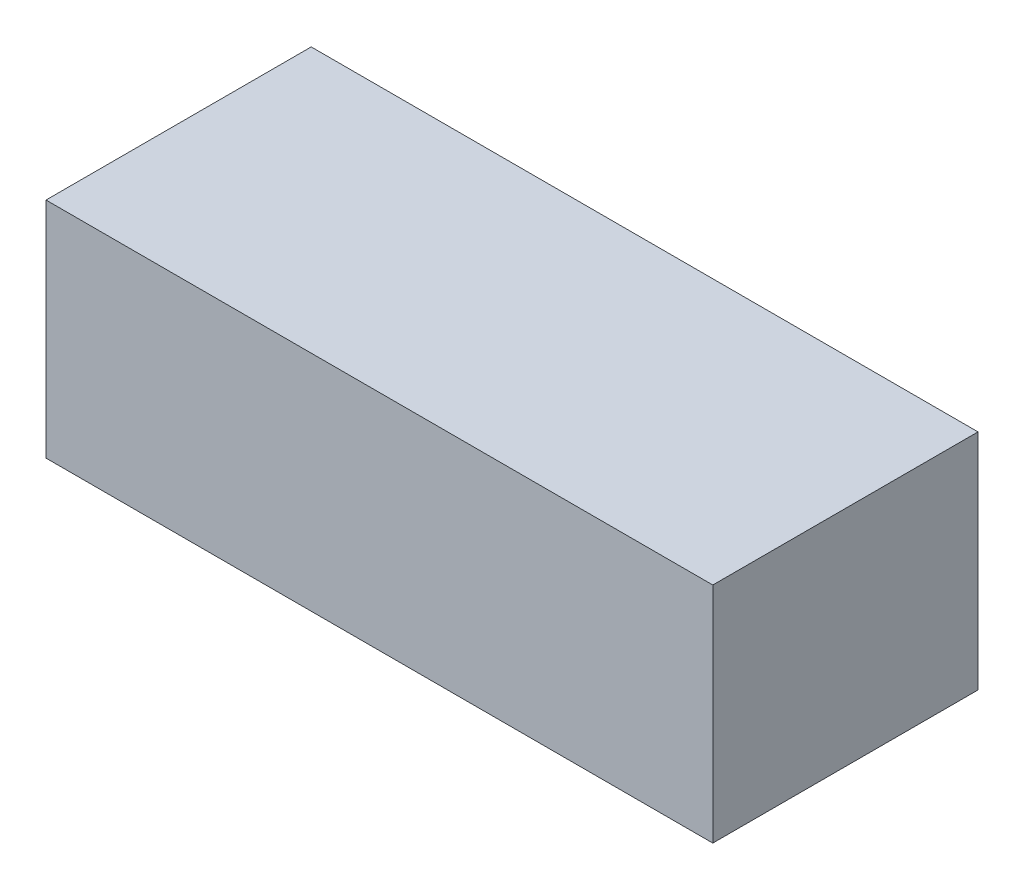
ISO-10303-21;
HEADER;
FILE_DESCRIPTION(('STEP AP214'),'2;1');
FILE_NAME('part.step','',(''),(''),'','','');
FILE_SCHEMA(('AUTOMOTIVE_DESIGN { 1 0 10303 214 1 1 1 1 }'));
ENDSEC;
DATA;
#1=APPLICATION_CONTEXT('core data for automotive mechanical design processes');
#2=APPLICATION_PROTOCOL_DEFINITION('international standard','automotive_design',2000,#1);
#3=PRODUCT_CONTEXT('',#1,'mechanical');
#4=PRODUCT('Part','Part','',(#3));
#5=PRODUCT_RELATED_PRODUCT_CATEGORY('part','',(#4));
#6=PRODUCT_DEFINITION_FORMATION('','',#4);
#7=PRODUCT_DEFINITION_CONTEXT('part definition',#1,'design');
#8=PRODUCT_DEFINITION('design','',#6,#7);
#9=PRODUCT_DEFINITION_SHAPE('','',#8);
#10=(LENGTH_UNIT() NAMED_UNIT(*) SI_UNIT(.MILLI.,.METRE.));
#11=(NAMED_UNIT(*) PLANE_ANGLE_UNIT() SI_UNIT($,.RADIAN.));
#12=(NAMED_UNIT(*) SI_UNIT($,.STERADIAN.) SOLID_ANGLE_UNIT());
#13=UNCERTAINTY_MEASURE_WITH_UNIT(LENGTH_MEASURE(1.E-05),#10,'distance_accuracy_value','');
#14=(GEOMETRIC_REPRESENTATION_CONTEXT(3) GLOBAL_UNCERTAINTY_ASSIGNED_CONTEXT((#13)) GLOBAL_UNIT_ASSIGNED_CONTEXT((#10,
#11,#12)) REPRESENTATION_CONTEXT('',''));
#15=CARTESIAN_POINT('',(0.,0.,0.));
#16=DIRECTION('',(0.,0.,1.));
#17=DIRECTION('',(1.,0.,0.));
#18=AXIS2_PLACEMENT_3D('',#15,#16,#17);
#19=CARTESIAN_POINT('',(-88.,59.,35.));
#20=DIRECTION('',(1.,0.,0.));
#21=DIRECTION('',(0.,0.,-1.));
#22=AXIS2_PLACEMENT_3D('',#19,#20,#21);
#23=PLANE('',#22);
#24=DIRECTION('',(0.,0.,1.));
#25=VECTOR('',#24,1.);
#26=CARTESIAN_POINT('',(-88.,0.,35.));
#27=LINE('',#26,#25);
#28=CARTESIAN_POINT('',(-88.,0.,-35.));
#29=VERTEX_POINT('',#28);
#30=CARTESIAN_POINT('',(-88.,0.,35.));
#31=VERTEX_POINT('',#30);
#32=EDGE_CURVE('E105',#29,#31,#27,.T.);
#33=ORIENTED_EDGE('',*,*,#32,.T.);
#34=DIRECTION('',(0.,-1.,0.));
#35=VECTOR('',#34,1.);
#36=CARTESIAN_POINT('',(-88.,59.,35.));
#37=LINE('',#36,#35);
#38=CARTESIAN_POINT('',(-88.,59.,35.));
#39=VERTEX_POINT('',#38);
#40=EDGE_CURVE('E11',#39,#31,#37,.T.);
#41=ORIENTED_EDGE('',*,*,#40,.F.);
#42=DIRECTION('',(0.,0.,1.));
#43=VECTOR('',#42,1.);
#44=CARTESIAN_POINT('',(-88.,59.,35.));
#45=LINE('',#44,#43);
#46=CARTESIAN_POINT('',(-88.,59.,-35.));
#47=VERTEX_POINT('',#46);
#48=EDGE_CURVE('E93',#47,#39,#45,.T.);
#49=ORIENTED_EDGE('',*,*,#48,.F.);
#50=DIRECTION('',(0.,-1.,0.));
#51=VECTOR('',#50,1.);
#52=CARTESIAN_POINT('',(-88.,59.,-35.));
#53=LINE('',#52,#51);
#54=EDGE_CURVE('E101',#47,#29,#53,.T.);
#55=ORIENTED_EDGE('',*,*,#54,.T.);
#56=EDGE_LOOP('',(#33,#41,#49,#55));
#57=FACE_BOUND('',#56,.T.);
#58=ADVANCED_FACE('F42',(#57),#23,.F.);
#59=CARTESIAN_POINT('',(88.,59.,35.));
#60=DIRECTION('',(0.,0.,-1.));
#61=DIRECTION('',(-1.,0.,0.));
#62=AXIS2_PLACEMENT_3D('',#59,#60,#61);
#63=PLANE('',#62);
#64=DIRECTION('',(1.,0.,0.));
#65=VECTOR('',#64,1.);
#66=CARTESIAN_POINT('',(88.,0.,35.));
#67=LINE('',#66,#65);
#68=CARTESIAN_POINT('',(88.,0.,35.));
#69=VERTEX_POINT('',#68);
#70=EDGE_CURVE('E97',#31,#69,#67,.T.);
#71=ORIENTED_EDGE('',*,*,#70,.T.);
#72=DIRECTION('',(0.,-1.,0.));
#73=VECTOR('',#72,1.);
#74=CARTESIAN_POINT('',(88.,59.,35.));
#75=LINE('',#74,#73);
#76=CARTESIAN_POINT('',(88.,59.,35.));
#77=VERTEX_POINT('',#76);
#78=EDGE_CURVE('E50',#77,#69,#75,.T.);
#79=ORIENTED_EDGE('',*,*,#78,.F.);
#80=DIRECTION('',(1.,0.,0.));
#81=VECTOR('',#80,1.);
#82=CARTESIAN_POINT('',(88.,59.,35.));
#83=LINE('',#82,#81);
#84=EDGE_CURVE('E88',#39,#77,#83,.T.);
#85=ORIENTED_EDGE('',*,*,#84,.F.);
#86=ORIENTED_EDGE('',*,*,#40,.T.);
#87=EDGE_LOOP('',(#71,#79,#85,#86));
#88=FACE_BOUND('',#87,.T.);
#89=ADVANCED_FACE('F96',(#88),#63,.F.);
#90=CARTESIAN_POINT('',(88.,59.,35.));
#91=DIRECTION('',(-1.,0.,0.));
#92=DIRECTION('',(0.,0.,1.));
#93=AXIS2_PLACEMENT_3D('',#90,#91,#92);
#94=PLANE('',#93);
#95=DIRECTION('',(0.,0.,-1.));
#96=VECTOR('',#95,1.);
#97=CARTESIAN_POINT('',(88.,0.,35.));
#98=LINE('',#97,#96);
#99=CARTESIAN_POINT('',(88.,0.,-35.));
#100=VERTEX_POINT('',#99);
#101=EDGE_CURVE('E75',#69,#100,#98,.T.);
#102=ORIENTED_EDGE('',*,*,#101,.T.);
#103=DIRECTION('',(0.,-1.,0.));
#104=VECTOR('',#103,1.);
#105=CARTESIAN_POINT('',(88.,59.,-35.));
#106=LINE('',#105,#104);
#107=CARTESIAN_POINT('',(88.,59.,-35.));
#108=VERTEX_POINT('',#107);
#109=EDGE_CURVE('E98',#108,#100,#106,.T.);
#110=ORIENTED_EDGE('',*,*,#109,.F.);
#111=DIRECTION('',(0.,0.,-1.));
#112=VECTOR('',#111,1.);
#113=CARTESIAN_POINT('',(88.,59.,35.));
#114=LINE('',#113,#112);
#115=EDGE_CURVE('E91',#77,#108,#114,.T.);
#116=ORIENTED_EDGE('',*,*,#115,.F.);
#117=ORIENTED_EDGE('',*,*,#78,.T.);
#118=EDGE_LOOP('',(#102,#110,#116,#117));
#119=FACE_BOUND('',#118,.T.);
#120=ADVANCED_FACE('F99',(#119),#94,.F.);
#121=CARTESIAN_POINT('',(88.,59.,-35.));
#122=DIRECTION('',(0.,0.,1.));
#123=DIRECTION('',(1.,0.,0.));
#124=AXIS2_PLACEMENT_3D('',#121,#122,#123);
#125=PLANE('',#124);
#126=DIRECTION('',(-1.,0.,0.));
#127=VECTOR('',#126,1.);
#128=CARTESIAN_POINT('',(88.,0.,-35.));
#129=LINE('',#128,#127);
#130=EDGE_CURVE('E81',#100,#29,#129,.T.);
#131=ORIENTED_EDGE('',*,*,#130,.T.);
#132=ORIENTED_EDGE('',*,*,#54,.F.);
#133=DIRECTION('',(-1.,0.,0.));
#134=VECTOR('',#133,1.);
#135=CARTESIAN_POINT('',(88.,59.,-35.));
#136=LINE('',#135,#134);
#137=EDGE_CURVE('E58',#108,#47,#136,.T.);
#138=ORIENTED_EDGE('',*,*,#137,.F.);
#139=ORIENTED_EDGE('',*,*,#109,.T.);
#140=EDGE_LOOP('',(#131,#132,#138,#139));
#141=FACE_BOUND('',#140,.T.);
#142=ADVANCED_FACE('F112',(#141),#125,.F.);
#143=CARTESIAN_POINT('',(0.,59.,0.));
#144=DIRECTION('',(0.,1.,0.));
#145=DIRECTION('',(0.,0.,1.));
#146=AXIS2_PLACEMENT_3D('',#143,#144,#145);
#147=PLANE('',#146);
#148=ORIENTED_EDGE('',*,*,#48,.T.);
#149=ORIENTED_EDGE('',*,*,#84,.T.);
#150=ORIENTED_EDGE('',*,*,#115,.T.);
#151=ORIENTED_EDGE('',*,*,#137,.T.);
#152=EDGE_LOOP('',(#148,#149,#150,#151));
#153=FACE_BOUND('',#152,.T.);
#154=ADVANCED_FACE('F89',(#153),#147,.T.);
#155=CARTESIAN_POINT('',(0.,0.,0.));
#156=DIRECTION('',(0.,1.,0.));
#157=DIRECTION('',(0.,0.,1.));
#158=AXIS2_PLACEMENT_3D('',#155,#156,#157);
#159=PLANE('',#158);
#160=ORIENTED_EDGE('',*,*,#32,.F.);
#161=ORIENTED_EDGE('',*,*,#130,.F.);
#162=ORIENTED_EDGE('',*,*,#101,.F.);
#163=ORIENTED_EDGE('',*,*,#70,.F.);
#164=EDGE_LOOP('',(#160,#161,#162,#163));
#165=FACE_BOUND('',#164,.T.);
#166=ADVANCED_FACE('F115',(#165),#159,.F.);
#167=CLOSED_SHELL('',(#58,#89,#120,#142,#154,#166));
#168=MANIFOLD_SOLID_BREP('B2',#167);
#169=ADVANCED_BREP_SHAPE_REPRESENTATION('',(#18,#168),#14);
#170=SHAPE_DEFINITION_REPRESENTATION(#9,#169);
ENDSEC;
END-ISO-10303-21;
